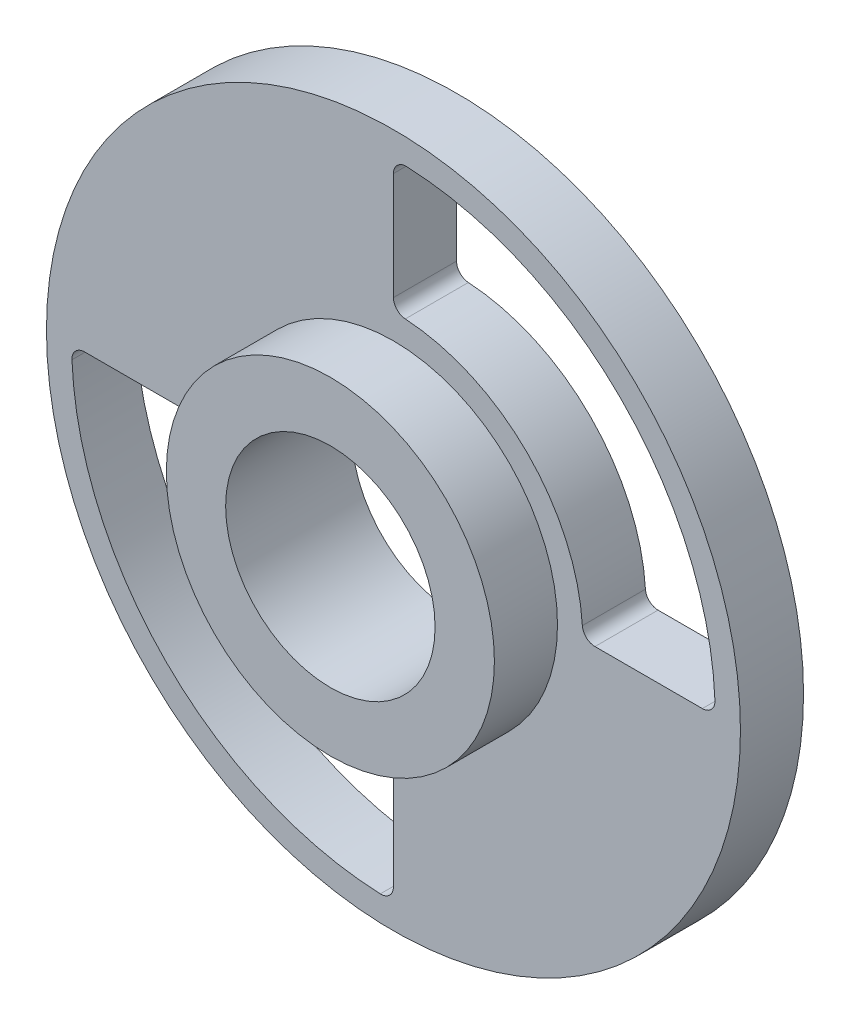
ISO-10303-21;
HEADER;
FILE_DESCRIPTION(('STEP AP214'),'2;1');
FILE_NAME('part.step','',(''),(''),'','','');
FILE_SCHEMA(('AUTOMOTIVE_DESIGN { 1 0 10303 214 1 1 1 1 }'));
ENDSEC;
DATA;
#1=APPLICATION_CONTEXT('core data for automotive mechanical design processes');
#2=APPLICATION_PROTOCOL_DEFINITION('international standard','automotive_design',2000,#1);
#3=PRODUCT_CONTEXT('',#1,'mechanical');
#4=PRODUCT('Part','Part','',(#3));
#5=PRODUCT_RELATED_PRODUCT_CATEGORY('part','',(#4));
#6=PRODUCT_DEFINITION_FORMATION('','',#4);
#7=PRODUCT_DEFINITION_CONTEXT('part definition',#1,'design');
#8=PRODUCT_DEFINITION('design','',#6,#7);
#9=PRODUCT_DEFINITION_SHAPE('','',#8);
#10=(LENGTH_UNIT() NAMED_UNIT(*) SI_UNIT(.MILLI.,.METRE.));
#11=(NAMED_UNIT(*) PLANE_ANGLE_UNIT() SI_UNIT($,.RADIAN.));
#12=(NAMED_UNIT(*) SI_UNIT($,.STERADIAN.) SOLID_ANGLE_UNIT());
#13=UNCERTAINTY_MEASURE_WITH_UNIT(LENGTH_MEASURE(1.E-05),#10,'distance_accuracy_value','');
#14=(GEOMETRIC_REPRESENTATION_CONTEXT(3) GLOBAL_UNCERTAINTY_ASSIGNED_CONTEXT((#13)) GLOBAL_UNIT_ASSIGNED_CONTEXT((#10,
#11,#12)) REPRESENTATION_CONTEXT('',''));
#15=CARTESIAN_POINT('',(0.,0.,0.));
#16=DIRECTION('',(0.,0.,1.));
#17=DIRECTION('',(1.,0.,0.));
#18=AXIS2_PLACEMENT_3D('',#15,#16,#17);
#19=CARTESIAN_POINT('',(0.,0.,2.5));
#20=DIRECTION('',(0.,0.,1.));
#21=DIRECTION('',(1.,0.,0.));
#22=AXIS2_PLACEMENT_3D('',#19,#20,#21);
#23=PLANE('',#22);
#24=CARTESIAN_POINT('',(0.,0.,2.5));
#25=DIRECTION('',(0.,0.,1.));
#26=DIRECTION('',(1.,0.,0.));
#27=AXIS2_PLACEMENT_3D('',#24,#25,#26);
#28=CIRCLE('',#27,7.5);
#29=CARTESIAN_POINT('',(-0.46875,-7.48533722937718,2.5));
#30=VERTEX_POINT('',#29);
#31=CARTESIAN_POINT('',(-7.48533722937718,-0.468749999999974,2.5));
#32=VERTEX_POINT('',#31);
#33=EDGE_CURVE('E222',#30,#32,#28,.F.);
#34=ORIENTED_EDGE('',*,*,#33,.F.);
#35=CARTESIAN_POINT('',(-0.5,-7.98435971133565,2.5));
#36=DIRECTION('',(0.,0.,1.));
#37=DIRECTION('',(1.,0.,0.));
#38=AXIS2_PLACEMENT_3D('',#35,#36,#37);
#39=CIRCLE('',#38,0.5);
#40=CARTESIAN_POINT('',(0.,-7.98435971133565,2.5));
#41=VERTEX_POINT('',#40);
#42=EDGE_CURVE('E213',#30,#41,#39,.F.);
#43=ORIENTED_EDGE('',*,*,#42,.T.);
#44=DIRECTION('',(0.,1.,0.));
#45=VECTOR('',#44,1.);
#46=CARTESIAN_POINT('',(0.,0.,2.5));
#47=LINE('',#46,#45);
#48=CARTESIAN_POINT('',(0.,-12.2397916648936,2.5));
#49=VERTEX_POINT('',#48);
#50=EDGE_CURVE('E219',#49,#41,#47,.T.);
#51=ORIENTED_EDGE('',*,*,#50,.F.);
#52=CARTESIAN_POINT('',(-0.5,-12.2397916648936,2.5));
#53=DIRECTION('',(0.,0.,1.));
#54=DIRECTION('',(1.,0.,0.));
#55=AXIS2_PLACEMENT_3D('',#52,#53,#54);
#56=CIRCLE('',#55,0.5);
#57=CARTESIAN_POINT('',(-0.520408163265306,-12.7393749981546,2.5));
#58=VERTEX_POINT('',#57);
#59=EDGE_CURVE('E11',#49,#58,#56,.F.);
#60=ORIENTED_EDGE('',*,*,#59,.T.);
#61=CARTESIAN_POINT('',(0.,0.,2.5));
#62=DIRECTION('',(0.,0.,1.));
#63=DIRECTION('',(1.,0.,0.));
#64=AXIS2_PLACEMENT_3D('',#61,#62,#63);
#65=CIRCLE('',#64,12.75);
#66=CARTESIAN_POINT('',(-12.7393749981546,-0.520408163265262,2.5));
#67=VERTEX_POINT('',#66);
#68=EDGE_CURVE('E226',#58,#67,#65,.F.);
#69=ORIENTED_EDGE('',*,*,#68,.T.);
#70=CARTESIAN_POINT('',(-12.2397916648936,-0.499999999999957,2.5));
#71=DIRECTION('',(0.,0.,1.));
#72=DIRECTION('',(1.,0.,0.));
#73=AXIS2_PLACEMENT_3D('',#70,#71,#72);
#74=CIRCLE('',#73,0.5);
#75=CARTESIAN_POINT('',(-12.2397916648936,0.,2.5));
#76=VERTEX_POINT('',#75);
#77=EDGE_CURVE('E210',#67,#76,#74,.F.);
#78=ORIENTED_EDGE('',*,*,#77,.T.);
#79=DIRECTION('',(1.,0.,0.));
#80=VECTOR('',#79,1.);
#81=CARTESIAN_POINT('',(0.,0.,2.5));
#82=LINE('',#81,#80);
#83=CARTESIAN_POINT('',(-7.98435971133565,0.,2.5));
#84=VERTEX_POINT('',#83);
#85=EDGE_CURVE('E283',#76,#84,#82,.T.);
#86=ORIENTED_EDGE('',*,*,#85,.T.);
#87=CARTESIAN_POINT('',(-7.98435971133566,-0.499999999999972,2.5));
#88=DIRECTION('',(0.,0.,1.));
#89=DIRECTION('',(1.,0.,0.));
#90=AXIS2_PLACEMENT_3D('',#87,#88,#89);
#91=CIRCLE('',#90,0.5);
#92=EDGE_CURVE('E206',#84,#32,#91,.F.);
#93=ORIENTED_EDGE('',*,*,#92,.T.);
#94=EDGE_LOOP('',(#34,#43,#51,#60,#69,#78,#86,#93));
#95=FACE_BOUND('',#94,.T.);
#96=CARTESIAN_POINT('',(0.,0.,2.5));
#97=DIRECTION('',(0.,0.,1.));
#98=DIRECTION('',(1.,0.,0.));
#99=AXIS2_PLACEMENT_3D('',#96,#97,#98);
#100=CIRCLE('',#99,7.5);
#101=CARTESIAN_POINT('',(0.46875,7.48533722937718,2.5));
#102=VERTEX_POINT('',#101);
#103=CARTESIAN_POINT('',(7.48533722937718,0.468749999999974,2.5));
#104=VERTEX_POINT('',#103);
#105=EDGE_CURVE('E151',#102,#104,#100,.F.);
#106=ORIENTED_EDGE('',*,*,#105,.F.);
#107=CARTESIAN_POINT('',(0.5,7.98435971133565,2.5));
#108=DIRECTION('',(0.,0.,1.));
#109=DIRECTION('',(1.,0.,0.));
#110=AXIS2_PLACEMENT_3D('',#107,#108,#109);
#111=CIRCLE('',#110,0.5);
#112=CARTESIAN_POINT('',(0.,7.98435971133565,2.5));
#113=VERTEX_POINT('',#112);
#114=EDGE_CURVE('E163',#102,#113,#111,.F.);
#115=ORIENTED_EDGE('',*,*,#114,.T.);
#116=DIRECTION('',(0.,-1.,0.));
#117=VECTOR('',#116,1.);
#118=CARTESIAN_POINT('',(0.,0.,2.5));
#119=LINE('',#118,#117);
#120=CARTESIAN_POINT('',(0.,12.2397916648936,2.5));
#121=VERTEX_POINT('',#120);
#122=EDGE_CURVE('E301',#121,#113,#119,.T.);
#123=ORIENTED_EDGE('',*,*,#122,.F.);
#124=CARTESIAN_POINT('',(0.5,12.2397916648936,2.5));
#125=DIRECTION('',(0.,0.,1.));
#126=DIRECTION('',(1.,0.,0.));
#127=AXIS2_PLACEMENT_3D('',#124,#125,#126);
#128=CIRCLE('',#127,0.5);
#129=CARTESIAN_POINT('',(0.520408163265306,12.7393749981546,2.5));
#130=VERTEX_POINT('',#129);
#131=EDGE_CURVE('E178',#121,#130,#128,.F.);
#132=ORIENTED_EDGE('',*,*,#131,.T.);
#133=CARTESIAN_POINT('',(0.,0.,2.5));
#134=DIRECTION('',(0.,0.,1.));
#135=DIRECTION('',(1.,0.,0.));
#136=AXIS2_PLACEMENT_3D('',#133,#134,#135);
#137=CIRCLE('',#136,12.75);
#138=CARTESIAN_POINT('',(12.7393749981546,0.520408163265262,2.5));
#139=VERTEX_POINT('',#138);
#140=EDGE_CURVE('E303',#130,#139,#137,.F.);
#141=ORIENTED_EDGE('',*,*,#140,.T.);
#142=CARTESIAN_POINT('',(12.2397916648936,0.499999999999957,2.5));
#143=DIRECTION('',(0.,0.,1.));
#144=DIRECTION('',(1.,0.,0.));
#145=AXIS2_PLACEMENT_3D('',#142,#143,#144);
#146=CIRCLE('',#145,0.5);
#147=CARTESIAN_POINT('',(12.2397916648936,0.,2.5));
#148=VERTEX_POINT('',#147);
#149=EDGE_CURVE('E180',#139,#148,#146,.F.);
#150=ORIENTED_EDGE('',*,*,#149,.T.);
#151=DIRECTION('',(-1.,0.,0.));
#152=VECTOR('',#151,1.);
#153=CARTESIAN_POINT('',(0.,0.,2.5));
#154=LINE('',#153,#152);
#155=CARTESIAN_POINT('',(7.98435971133565,0.,2.5));
#156=VERTEX_POINT('',#155);
#157=EDGE_CURVE('E169',#148,#156,#154,.T.);
#158=ORIENTED_EDGE('',*,*,#157,.T.);
#159=CARTESIAN_POINT('',(7.98435971133566,0.499999999999972,2.5));
#160=DIRECTION('',(0.,0.,1.));
#161=DIRECTION('',(1.,0.,0.));
#162=AXIS2_PLACEMENT_3D('',#159,#160,#161);
#163=CIRCLE('',#162,0.5);
#164=EDGE_CURVE('E167',#156,#104,#163,.F.);
#165=ORIENTED_EDGE('',*,*,#164,.T.);
#166=EDGE_LOOP('',(#106,#115,#123,#132,#141,#150,#158,#165));
#167=FACE_BOUND('',#166,.T.);
#168=CARTESIAN_POINT('',(0.,0.,2.5));
#169=DIRECTION('',(0.,0.,1.));
#170=DIRECTION('',(1.,0.,0.));
#171=AXIS2_PLACEMENT_3D('',#168,#169,#170);
#172=CIRCLE('',#171,13.75);
#173=CARTESIAN_POINT('',(13.75,0.,2.5));
#174=VERTEX_POINT('',#173);
#175=EDGE_CURVE('E158',#174,#174,#172,.T.);
#176=ORIENTED_EDGE('',*,*,#175,.T.);
#177=EDGE_LOOP('',(#176));
#178=FACE_BOUND('',#177,.T.);
#179=CARTESIAN_POINT('',(0.,0.,2.5));
#180=DIRECTION('',(0.,0.,1.));
#181=DIRECTION('',(1.,0.,0.));
#182=AXIS2_PLACEMENT_3D('',#179,#180,#181);
#183=CIRCLE('',#182,6.5);
#184=CARTESIAN_POINT('',(6.5,0.,2.5));
#185=VERTEX_POINT('',#184);
#186=EDGE_CURVE('E309',#185,#185,#183,.T.);
#187=ORIENTED_EDGE('',*,*,#186,.F.);
#188=EDGE_LOOP('',(#187));
#189=FACE_BOUND('',#188,.T.);
#190=ADVANCED_FACE('F33',(#95,#167,#178,#189),#23,.T.);
#191=CARTESIAN_POINT('',(0.,0.,0.));
#192=DIRECTION('',(0.,0.,1.));
#193=DIRECTION('',(1.,0.,0.));
#194=AXIS2_PLACEMENT_3D('',#191,#192,#193);
#195=PLANE('',#194);
#196=DIRECTION('',(0.,-1.,0.));
#197=VECTOR('',#196,1.);
#198=CARTESIAN_POINT('',(0.,0.,0.));
#199=LINE('',#198,#197);
#200=CARTESIAN_POINT('',(0.,-7.98435971133565,0.));
#201=VERTEX_POINT('',#200);
#202=CARTESIAN_POINT('',(0.,-12.2397916648936,0.));
#203=VERTEX_POINT('',#202);
#204=EDGE_CURVE('E227',#201,#203,#199,.T.);
#205=ORIENTED_EDGE('',*,*,#204,.F.);
#206=CARTESIAN_POINT('',(-0.5,-7.98435971133565,0.));
#207=DIRECTION('',(0.,0.,1.));
#208=DIRECTION('',(1.,0.,0.));
#209=AXIS2_PLACEMENT_3D('',#206,#207,#208);
#210=CIRCLE('',#209,0.5);
#211=CARTESIAN_POINT('',(-0.46875,-7.48533722937718,0.));
#212=VERTEX_POINT('',#211);
#213=EDGE_CURVE('E55',#201,#212,#210,.T.);
#214=ORIENTED_EDGE('',*,*,#213,.T.);
#215=CARTESIAN_POINT('',(0.,0.,0.));
#216=DIRECTION('',(0.,0.,1.));
#217=DIRECTION('',(-1.,0.,0.));
#218=AXIS2_PLACEMENT_3D('',#215,#216,#217);
#219=CIRCLE('',#218,7.5);
#220=CARTESIAN_POINT('',(-7.48533722937718,-0.468749999999974,0.));
#221=VERTEX_POINT('',#220);
#222=EDGE_CURVE('E529',#221,#212,#219,.T.);
#223=ORIENTED_EDGE('',*,*,#222,.F.);
#224=CARTESIAN_POINT('',(-7.98435971133566,-0.499999999999972,0.));
#225=DIRECTION('',(0.,0.,1.));
#226=DIRECTION('',(1.,0.,0.));
#227=AXIS2_PLACEMENT_3D('',#224,#225,#226);
#228=CIRCLE('',#227,0.5);
#229=CARTESIAN_POINT('',(-7.98435971133565,0.,0.));
#230=VERTEX_POINT('',#229);
#231=EDGE_CURVE('E204',#221,#230,#228,.T.);
#232=ORIENTED_EDGE('',*,*,#231,.T.);
#233=DIRECTION('',(-1.,0.,0.));
#234=VECTOR('',#233,1.);
#235=CARTESIAN_POINT('',(0.,0.,0.));
#236=LINE('',#235,#234);
#237=CARTESIAN_POINT('',(-12.2397916648936,0.,0.));
#238=VERTEX_POINT('',#237);
#239=EDGE_CURVE('E523',#230,#238,#236,.T.);
#240=ORIENTED_EDGE('',*,*,#239,.T.);
#241=CARTESIAN_POINT('',(-12.2397916648936,-0.499999999999957,0.));
#242=DIRECTION('',(0.,0.,1.));
#243=DIRECTION('',(1.,0.,0.));
#244=AXIS2_PLACEMENT_3D('',#241,#242,#243);
#245=CIRCLE('',#244,0.5);
#246=CARTESIAN_POINT('',(-12.7393749981546,-0.520408163265262,0.));
#247=VERTEX_POINT('',#246);
#248=EDGE_CURVE('E208',#238,#247,#245,.T.);
#249=ORIENTED_EDGE('',*,*,#248,.T.);
#250=CARTESIAN_POINT('',(0.,0.,0.));
#251=DIRECTION('',(0.,0.,1.));
#252=DIRECTION('',(-1.,0.,0.));
#253=AXIS2_PLACEMENT_3D('',#250,#251,#252);
#254=CIRCLE('',#253,12.75);
#255=CARTESIAN_POINT('',(-0.520408163265306,-12.7393749981546,0.));
#256=VERTEX_POINT('',#255);
#257=EDGE_CURVE('E518',#247,#256,#254,.T.);
#258=ORIENTED_EDGE('',*,*,#257,.T.);
#259=CARTESIAN_POINT('',(-0.5,-12.2397916648936,0.));
#260=DIRECTION('',(0.,0.,1.));
#261=DIRECTION('',(1.,0.,0.));
#262=AXIS2_PLACEMENT_3D('',#259,#260,#261);
#263=CIRCLE('',#262,0.5);
#264=EDGE_CURVE('E41',#256,#203,#263,.T.);
#265=ORIENTED_EDGE('',*,*,#264,.T.);
#266=EDGE_LOOP('',(#205,#214,#223,#232,#240,#249,#258,#265));
#267=FACE_BOUND('',#266,.T.);
#268=DIRECTION('',(0.,1.,0.));
#269=VECTOR('',#268,1.);
#270=CARTESIAN_POINT('',(0.,0.,0.));
#271=LINE('',#270,#269);
#272=CARTESIAN_POINT('',(0.,7.98435971133565,0.));
#273=VERTEX_POINT('',#272);
#274=CARTESIAN_POINT('',(0.,12.2397916648936,0.));
#275=VERTEX_POINT('',#274);
#276=EDGE_CURVE('E298',#273,#275,#271,.T.);
#277=ORIENTED_EDGE('',*,*,#276,.F.);
#278=CARTESIAN_POINT('',(0.5,7.98435971133565,0.));
#279=DIRECTION('',(0.,0.,1.));
#280=DIRECTION('',(1.,0.,0.));
#281=AXIS2_PLACEMENT_3D('',#278,#279,#280);
#282=CIRCLE('',#281,0.5);
#283=CARTESIAN_POINT('',(0.46875,7.48533722937718,0.));
#284=VERTEX_POINT('',#283);
#285=EDGE_CURVE('E176',#273,#284,#282,.T.);
#286=ORIENTED_EDGE('',*,*,#285,.T.);
#287=CARTESIAN_POINT('',(0.,0.,0.));
#288=DIRECTION('',(0.,0.,1.));
#289=DIRECTION('',(1.,0.,0.));
#290=AXIS2_PLACEMENT_3D('',#287,#288,#289);
#291=CIRCLE('',#290,7.5);
#292=CARTESIAN_POINT('',(7.48533722937718,0.468749999999974,0.));
#293=VERTEX_POINT('',#292);
#294=EDGE_CURVE('E154',#293,#284,#291,.T.);
#295=ORIENTED_EDGE('',*,*,#294,.F.);
#296=CARTESIAN_POINT('',(7.98435971133566,0.499999999999972,0.));
#297=DIRECTION('',(0.,0.,1.));
#298=DIRECTION('',(1.,0.,0.));
#299=AXIS2_PLACEMENT_3D('',#296,#297,#298);
#300=CIRCLE('',#299,0.5);
#301=CARTESIAN_POINT('',(7.98435971133565,0.,0.));
#302=VERTEX_POINT('',#301);
#303=EDGE_CURVE('E337',#293,#302,#300,.T.);
#304=ORIENTED_EDGE('',*,*,#303,.T.);
#305=DIRECTION('',(1.,0.,0.));
#306=VECTOR('',#305,1.);
#307=CARTESIAN_POINT('',(0.,0.,0.));
#308=LINE('',#307,#306);
#309=CARTESIAN_POINT('',(12.2397916648936,0.,0.));
#310=VERTEX_POINT('',#309);
#311=EDGE_CURVE('E288',#302,#310,#308,.T.);
#312=ORIENTED_EDGE('',*,*,#311,.T.);
#313=CARTESIAN_POINT('',(12.2397916648936,0.499999999999957,0.));
#314=DIRECTION('',(0.,0.,1.));
#315=DIRECTION('',(1.,0.,0.));
#316=AXIS2_PLACEMENT_3D('',#313,#314,#315);
#317=CIRCLE('',#316,0.5);
#318=CARTESIAN_POINT('',(12.7393749981546,0.520408163265262,0.));
#319=VERTEX_POINT('',#318);
#320=EDGE_CURVE('E340',#310,#319,#317,.T.);
#321=ORIENTED_EDGE('',*,*,#320,.T.);
#322=CARTESIAN_POINT('',(0.,0.,0.));
#323=DIRECTION('',(0.,0.,1.));
#324=DIRECTION('',(1.,0.,0.));
#325=AXIS2_PLACEMENT_3D('',#322,#323,#324);
#326=CIRCLE('',#325,12.75);
#327=CARTESIAN_POINT('',(0.520408163265306,12.7393749981546,0.));
#328=VERTEX_POINT('',#327);
#329=EDGE_CURVE('E295',#319,#328,#326,.T.);
#330=ORIENTED_EDGE('',*,*,#329,.T.);
#331=CARTESIAN_POINT('',(0.5,12.2397916648936,0.));
#332=DIRECTION('',(0.,0.,1.));
#333=DIRECTION('',(1.,0.,0.));
#334=AXIS2_PLACEMENT_3D('',#331,#332,#333);
#335=CIRCLE('',#334,0.5);
#336=EDGE_CURVE('E175',#328,#275,#335,.T.);
#337=ORIENTED_EDGE('',*,*,#336,.T.);
#338=EDGE_LOOP('',(#277,#286,#295,#304,#312,#321,#330,#337));
#339=FACE_BOUND('',#338,.T.);
#340=CARTESIAN_POINT('',(0.,0.,0.));
#341=DIRECTION('',(0.,0.,1.));
#342=DIRECTION('',(1.,0.,0.));
#343=AXIS2_PLACEMENT_3D('',#340,#341,#342);
#344=CIRCLE('',#343,13.75);
#345=CARTESIAN_POINT('',(13.75,0.,0.));
#346=VERTEX_POINT('',#345);
#347=EDGE_CURVE('E318',#346,#346,#344,.T.);
#348=ORIENTED_EDGE('',*,*,#347,.F.);
#349=EDGE_LOOP('',(#348));
#350=FACE_BOUND('',#349,.T.);
#351=CARTESIAN_POINT('',(0.,0.,0.));
#352=DIRECTION('',(0.,0.,1.));
#353=DIRECTION('',(1.,0.,0.));
#354=AXIS2_PLACEMENT_3D('',#351,#352,#353);
#355=CIRCLE('',#354,4.15);
#356=CARTESIAN_POINT('',(4.15,0.,0.));
#357=VERTEX_POINT('',#356);
#358=EDGE_CURVE('E313',#357,#357,#355,.T.);
#359=ORIENTED_EDGE('',*,*,#358,.T.);
#360=EDGE_LOOP('',(#359));
#361=FACE_BOUND('',#360,.T.);
#362=ADVANCED_FACE('F241',(#267,#339,#350,#361),#195,.F.);
#363=CARTESIAN_POINT('',(0.,0.,2.5));
#364=DIRECTION('',(0.,0.,-1.));
#365=DIRECTION('',(-1.,0.,0.));
#366=AXIS2_PLACEMENT_3D('',#363,#364,#365);
#367=CYLINDRICAL_SURFACE('',#366,13.75);
#368=ORIENTED_EDGE('',*,*,#175,.F.);
#369=EDGE_LOOP('',(#368));
#370=FACE_BOUND('',#369,.T.);
#371=ORIENTED_EDGE('',*,*,#347,.T.);
#372=EDGE_LOOP('',(#371));
#373=FACE_BOUND('',#372,.T.);
#374=ADVANCED_FACE('F246',(#370,#373),#367,.T.);
#375=CARTESIAN_POINT('',(0.,0.,2.5));
#376=DIRECTION('',(0.,0.,-1.));
#377=DIRECTION('',(-1.,0.,0.));
#378=AXIS2_PLACEMENT_3D('',#375,#376,#377);
#379=CYLINDRICAL_SURFACE('',#378,4.15);
#380=ORIENTED_EDGE('',*,*,#358,.F.);
#381=EDGE_LOOP('',(#380));
#382=FACE_BOUND('',#381,.T.);
#383=CARTESIAN_POINT('',(0.,0.,5.));
#384=DIRECTION('',(0.,0.,1.));
#385=DIRECTION('',(1.,0.,0.));
#386=AXIS2_PLACEMENT_3D('',#383,#384,#385);
#387=CIRCLE('',#386,4.15);
#388=CARTESIAN_POINT('',(4.15,0.,5.));
#389=VERTEX_POINT('',#388);
#390=EDGE_CURVE('E168',#389,#389,#387,.T.);
#391=ORIENTED_EDGE('',*,*,#390,.T.);
#392=EDGE_LOOP('',(#391));
#393=FACE_BOUND('',#392,.T.);
#394=ADVANCED_FACE('F249',(#382,#393),#379,.F.);
#395=CARTESIAN_POINT('',(0.,0.,5.));
#396=DIRECTION('',(0.,0.,1.));
#397=DIRECTION('',(1.,0.,0.));
#398=AXIS2_PLACEMENT_3D('',#395,#396,#397);
#399=PLANE('',#398);
#400=CARTESIAN_POINT('',(0.,0.,5.));
#401=DIRECTION('',(0.,0.,1.));
#402=DIRECTION('',(1.,0.,0.));
#403=AXIS2_PLACEMENT_3D('',#400,#401,#402);
#404=CIRCLE('',#403,6.5);
#405=CARTESIAN_POINT('',(6.5,0.,5.));
#406=VERTEX_POINT('',#405);
#407=EDGE_CURVE('E310',#406,#406,#404,.T.);
#408=ORIENTED_EDGE('',*,*,#407,.T.);
#409=EDGE_LOOP('',(#408));
#410=FACE_BOUND('',#409,.T.);
#411=ORIENTED_EDGE('',*,*,#390,.F.);
#412=EDGE_LOOP('',(#411));
#413=FACE_BOUND('',#412,.T.);
#414=ADVANCED_FACE('F374',(#410,#413),#399,.T.);
#415=CARTESIAN_POINT('',(0.,0.,5.));
#416=DIRECTION('',(0.,0.,-1.));
#417=DIRECTION('',(-1.,0.,0.));
#418=AXIS2_PLACEMENT_3D('',#415,#416,#417);
#419=CYLINDRICAL_SURFACE('',#418,6.5);
#420=ORIENTED_EDGE('',*,*,#407,.F.);
#421=EDGE_LOOP('',(#420));
#422=FACE_BOUND('',#421,.T.);
#423=ORIENTED_EDGE('',*,*,#186,.T.);
#424=EDGE_LOOP('',(#423));
#425=FACE_BOUND('',#424,.T.);
#426=ADVANCED_FACE('F373',(#422,#425),#419,.T.);
#427=CARTESIAN_POINT('',(0.,0.,5.));
#428=DIRECTION('',(0.,0.,-1.));
#429=DIRECTION('',(-1.,0.,0.));
#430=AXIS2_PLACEMENT_3D('',#427,#428,#429);
#431=CYLINDRICAL_SURFACE('',#430,7.5);
#432=ORIENTED_EDGE('',*,*,#105,.T.);
#433=DIRECTION('',(0.,0.,-1.));
#434=VECTOR('',#433,1.);
#435=CARTESIAN_POINT('',(7.48533722937718,0.468749999999974,5.));
#436=LINE('',#435,#434);
#437=EDGE_CURVE('E157',#104,#293,#436,.T.);
#438=ORIENTED_EDGE('',*,*,#437,.T.);
#439=ORIENTED_EDGE('',*,*,#294,.T.);
#440=DIRECTION('',(0.,0.,-1.));
#441=VECTOR('',#440,1.);
#442=CARTESIAN_POINT('',(0.46875,7.48533722937718,5.));
#443=LINE('',#442,#441);
#444=EDGE_CURVE('E147',#284,#102,#443,.F.);
#445=ORIENTED_EDGE('',*,*,#444,.T.);
#446=EDGE_LOOP('',(#432,#438,#439,#445));
#447=FACE_BOUND('',#446,.T.);
#448=ADVANCED_FACE('F149',(#447),#431,.T.);
#449=CARTESIAN_POINT('',(0.,0.,5.));
#450=DIRECTION('',(0.,1.,0.));
#451=DIRECTION('',(-1.,0.,0.));
#452=AXIS2_PLACEMENT_3D('',#449,#450,#451);
#453=PLANE('',#452);
#454=ORIENTED_EDGE('',*,*,#311,.F.);
#455=DIRECTION('',(0.,0.,-1.));
#456=VECTOR('',#455,1.);
#457=CARTESIAN_POINT('',(7.98435971133565,0.,5.));
#458=LINE('',#457,#456);
#459=EDGE_CURVE('E327',#302,#156,#458,.F.);
#460=ORIENTED_EDGE('',*,*,#459,.T.);
#461=ORIENTED_EDGE('',*,*,#157,.F.);
#462=DIRECTION('',(0.,0.,1.));
#463=VECTOR('',#462,1.);
#464=CARTESIAN_POINT('',(12.2397916648936,0.,0.));
#465=LINE('',#464,#463);
#466=EDGE_CURVE('E324',#148,#310,#465,.F.);
#467=ORIENTED_EDGE('',*,*,#466,.T.);
#468=EDGE_LOOP('',(#454,#460,#461,#467));
#469=FACE_BOUND('',#468,.T.);
#470=ADVANCED_FACE('F348',(#469),#453,.T.);
#471=CARTESIAN_POINT('',(0.,0.,5.));
#472=DIRECTION('',(0.,0.,-1.));
#473=DIRECTION('',(-1.,0.,0.));
#474=AXIS2_PLACEMENT_3D('',#471,#472,#473);
#475=CYLINDRICAL_SURFACE('',#474,12.75);
#476=ORIENTED_EDGE('',*,*,#329,.F.);
#477=DIRECTION('',(0.,0.,-1.));
#478=VECTOR('',#477,1.);
#479=CARTESIAN_POINT('',(12.7393749981546,0.520408163265262,5.));
#480=LINE('',#479,#478);
#481=EDGE_CURVE('E332',#319,#139,#480,.F.);
#482=ORIENTED_EDGE('',*,*,#481,.T.);
#483=ORIENTED_EDGE('',*,*,#140,.F.);
#484=DIRECTION('',(0.,0.,-1.));
#485=VECTOR('',#484,1.);
#486=CARTESIAN_POINT('',(0.520408163265306,12.7393749981546,5.));
#487=LINE('',#486,#485);
#488=EDGE_CURVE('E329',#130,#328,#487,.T.);
#489=ORIENTED_EDGE('',*,*,#488,.T.);
#490=EDGE_LOOP('',(#476,#482,#483,#489));
#491=FACE_BOUND('',#490,.T.);
#492=ADVANCED_FACE('F355',(#491),#475,.F.);
#493=CARTESIAN_POINT('',(0.,0.,5.));
#494=DIRECTION('',(-1.,0.,0.));
#495=DIRECTION('',(0.,0.,1.));
#496=AXIS2_PLACEMENT_3D('',#493,#494,#495);
#497=PLANE('',#496);
#498=ORIENTED_EDGE('',*,*,#122,.T.);
#499=DIRECTION('',(0.,0.,1.));
#500=VECTOR('',#499,1.);
#501=CARTESIAN_POINT('',(0.,7.98435971133565,0.));
#502=LINE('',#501,#500);
#503=EDGE_CURVE('E174',#113,#273,#502,.F.);
#504=ORIENTED_EDGE('',*,*,#503,.T.);
#505=ORIENTED_EDGE('',*,*,#276,.T.);
#506=DIRECTION('',(0.,0.,-1.));
#507=VECTOR('',#506,1.);
#508=CARTESIAN_POINT('',(0.,12.2397916648936,5.));
#509=LINE('',#508,#507);
#510=EDGE_CURVE('E334',#275,#121,#509,.F.);
#511=ORIENTED_EDGE('',*,*,#510,.T.);
#512=EDGE_LOOP('',(#498,#504,#505,#511));
#513=FACE_BOUND('',#512,.T.);
#514=ADVANCED_FACE('F259',(#513),#497,.F.);
#515=CARTESIAN_POINT('',(7.98435971133566,0.499999999999972,5.));
#516=DIRECTION('',(0.,0.,-1.));
#517=DIRECTION('',(-1.,0.,0.));
#518=AXIS2_PLACEMENT_3D('',#515,#516,#517);
#519=CYLINDRICAL_SURFACE('',#518,0.5);
#520=ORIENTED_EDGE('',*,*,#164,.F.);
#521=ORIENTED_EDGE('',*,*,#459,.F.);
#522=ORIENTED_EDGE('',*,*,#303,.F.);
#523=ORIENTED_EDGE('',*,*,#437,.F.);
#524=EDGE_LOOP('',(#520,#521,#522,#523));
#525=FACE_BOUND('',#524,.T.);
#526=ADVANCED_FACE('F255',(#525),#519,.F.);
#527=CARTESIAN_POINT('',(12.2397916648936,0.499999999999957,5.));
#528=DIRECTION('',(0.,0.,-1.));
#529=DIRECTION('',(-1.,0.,0.));
#530=AXIS2_PLACEMENT_3D('',#527,#528,#529);
#531=CYLINDRICAL_SURFACE('',#530,0.5);
#532=ORIENTED_EDGE('',*,*,#149,.F.);
#533=ORIENTED_EDGE('',*,*,#481,.F.);
#534=ORIENTED_EDGE('',*,*,#320,.F.);
#535=ORIENTED_EDGE('',*,*,#466,.F.);
#536=EDGE_LOOP('',(#532,#533,#534,#535));
#537=FACE_BOUND('',#536,.T.);
#538=ADVANCED_FACE('F258',(#537),#531,.F.);
#539=CARTESIAN_POINT('',(0.5,7.98435971133565,5.));
#540=DIRECTION('',(0.,0.,-1.));
#541=DIRECTION('',(-1.,0.,0.));
#542=AXIS2_PLACEMENT_3D('',#539,#540,#541);
#543=CYLINDRICAL_SURFACE('',#542,0.5);
#544=ORIENTED_EDGE('',*,*,#114,.F.);
#545=ORIENTED_EDGE('',*,*,#444,.F.);
#546=ORIENTED_EDGE('',*,*,#285,.F.);
#547=ORIENTED_EDGE('',*,*,#503,.F.);
#548=EDGE_LOOP('',(#544,#545,#546,#547));
#549=FACE_BOUND('',#548,.T.);
#550=ADVANCED_FACE('F172',(#549),#543,.F.);
#551=CARTESIAN_POINT('',(0.5,12.2397916648936,5.));
#552=DIRECTION('',(0.,0.,-1.));
#553=DIRECTION('',(-1.,0.,0.));
#554=AXIS2_PLACEMENT_3D('',#551,#552,#553);
#555=CYLINDRICAL_SURFACE('',#554,0.5);
#556=ORIENTED_EDGE('',*,*,#131,.F.);
#557=ORIENTED_EDGE('',*,*,#510,.F.);
#558=ORIENTED_EDGE('',*,*,#336,.F.);
#559=ORIENTED_EDGE('',*,*,#488,.F.);
#560=EDGE_LOOP('',(#556,#557,#558,#559));
#561=FACE_BOUND('',#560,.T.);
#562=ADVANCED_FACE('F266',(#561),#555,.F.);
#563=CARTESIAN_POINT('',(0.,0.,5.));
#564=DIRECTION('',(0.,0.,-1.));
#565=DIRECTION('',(-1.,0.,0.));
#566=AXIS2_PLACEMENT_3D('',#563,#564,#565);
#567=CYLINDRICAL_SURFACE('',#566,7.5);
#568=ORIENTED_EDGE('',*,*,#33,.T.);
#569=DIRECTION('',(0.,0.,-1.));
#570=VECTOR('',#569,1.);
#571=CARTESIAN_POINT('',(-7.48533722937718,-0.468749999999974,5.));
#572=LINE('',#571,#570);
#573=EDGE_CURVE('E187',#32,#221,#572,.T.);
#574=ORIENTED_EDGE('',*,*,#573,.T.);
#575=ORIENTED_EDGE('',*,*,#222,.T.);
#576=DIRECTION('',(0.,0.,-1.));
#577=VECTOR('',#576,1.);
#578=CARTESIAN_POINT('',(-0.46875,-7.48533722937718,5.));
#579=LINE('',#578,#577);
#580=EDGE_CURVE('E185',#212,#30,#579,.F.);
#581=ORIENTED_EDGE('',*,*,#580,.T.);
#582=EDGE_LOOP('',(#568,#574,#575,#581));
#583=FACE_BOUND('',#582,.T.);
#584=ADVANCED_FACE('F269',(#583),#567,.T.);
#585=CARTESIAN_POINT('',(0.,0.,5.));
#586=DIRECTION('',(0.,-1.,0.));
#587=DIRECTION('',(1.,0.,0.));
#588=AXIS2_PLACEMENT_3D('',#585,#586,#587);
#589=PLANE('',#588);
#590=ORIENTED_EDGE('',*,*,#239,.F.);
#591=DIRECTION('',(0.,0.,-1.));
#592=VECTOR('',#591,1.);
#593=CARTESIAN_POINT('',(-7.98435971133565,0.,5.));
#594=LINE('',#593,#592);
#595=EDGE_CURVE('E193',#230,#84,#594,.F.);
#596=ORIENTED_EDGE('',*,*,#595,.T.);
#597=ORIENTED_EDGE('',*,*,#85,.F.);
#598=DIRECTION('',(0.,0.,1.));
#599=VECTOR('',#598,1.);
#600=CARTESIAN_POINT('',(-12.2397916648936,0.,0.));
#601=LINE('',#600,#599);
#602=EDGE_CURVE('E190',#76,#238,#601,.F.);
#603=ORIENTED_EDGE('',*,*,#602,.T.);
#604=EDGE_LOOP('',(#590,#596,#597,#603));
#605=FACE_BOUND('',#604,.T.);
#606=ADVANCED_FACE('F471',(#605),#589,.T.);
#607=CARTESIAN_POINT('',(0.,0.,5.));
#608=DIRECTION('',(0.,0.,-1.));
#609=DIRECTION('',(-1.,0.,0.));
#610=AXIS2_PLACEMENT_3D('',#607,#608,#609);
#611=CYLINDRICAL_SURFACE('',#610,12.75);
#612=ORIENTED_EDGE('',*,*,#257,.F.);
#613=DIRECTION('',(0.,0.,-1.));
#614=VECTOR('',#613,1.);
#615=CARTESIAN_POINT('',(-12.7393749981546,-0.520408163265262,5.));
#616=LINE('',#615,#614);
#617=EDGE_CURVE('E198',#247,#67,#616,.F.);
#618=ORIENTED_EDGE('',*,*,#617,.T.);
#619=ORIENTED_EDGE('',*,*,#68,.F.);
#620=DIRECTION('',(0.,0.,-1.));
#621=VECTOR('',#620,1.);
#622=CARTESIAN_POINT('',(-0.520408163265306,-12.7393749981546,5.));
#623=LINE('',#622,#621);
#624=EDGE_CURVE('E195',#58,#256,#623,.T.);
#625=ORIENTED_EDGE('',*,*,#624,.T.);
#626=EDGE_LOOP('',(#612,#618,#619,#625));
#627=FACE_BOUND('',#626,.T.);
#628=ADVANCED_FACE('F276',(#627),#611,.F.);
#629=CARTESIAN_POINT('',(0.,0.,5.));
#630=DIRECTION('',(1.,0.,0.));
#631=DIRECTION('',(0.,0.,-1.));
#632=AXIS2_PLACEMENT_3D('',#629,#630,#631);
#633=PLANE('',#632);
#634=ORIENTED_EDGE('',*,*,#50,.T.);
#635=DIRECTION('',(0.,0.,1.));
#636=VECTOR('',#635,1.);
#637=CARTESIAN_POINT('',(0.,-7.98435971133565,0.));
#638=LINE('',#637,#636);
#639=EDGE_CURVE('E202',#41,#201,#638,.F.);
#640=ORIENTED_EDGE('',*,*,#639,.T.);
#641=ORIENTED_EDGE('',*,*,#204,.T.);
#642=DIRECTION('',(0.,0.,-1.));
#643=VECTOR('',#642,1.);
#644=CARTESIAN_POINT('',(0.,-12.2397916648936,5.));
#645=LINE('',#644,#643);
#646=EDGE_CURVE('E200',#203,#49,#645,.F.);
#647=ORIENTED_EDGE('',*,*,#646,.T.);
#648=EDGE_LOOP('',(#634,#640,#641,#647));
#649=FACE_BOUND('',#648,.T.);
#650=ADVANCED_FACE('F224',(#649),#633,.F.);
#651=CARTESIAN_POINT('',(-7.98435971133566,-0.499999999999972,5.));
#652=DIRECTION('',(0.,0.,-1.));
#653=DIRECTION('',(-1.,0.,0.));
#654=AXIS2_PLACEMENT_3D('',#651,#652,#653);
#655=CYLINDRICAL_SURFACE('',#654,0.5);
#656=ORIENTED_EDGE('',*,*,#92,.F.);
#657=ORIENTED_EDGE('',*,*,#595,.F.);
#658=ORIENTED_EDGE('',*,*,#231,.F.);
#659=ORIENTED_EDGE('',*,*,#573,.F.);
#660=EDGE_LOOP('',(#656,#657,#658,#659));
#661=FACE_BOUND('',#660,.T.);
#662=ADVANCED_FACE('F237',(#661),#655,.F.);
#663=CARTESIAN_POINT('',(-12.2397916648936,-0.499999999999957,5.));
#664=DIRECTION('',(0.,0.,-1.));
#665=DIRECTION('',(-1.,0.,0.));
#666=AXIS2_PLACEMENT_3D('',#663,#664,#665);
#667=CYLINDRICAL_SURFACE('',#666,0.5);
#668=ORIENTED_EDGE('',*,*,#77,.F.);
#669=ORIENTED_EDGE('',*,*,#617,.F.);
#670=ORIENTED_EDGE('',*,*,#248,.F.);
#671=ORIENTED_EDGE('',*,*,#602,.F.);
#672=EDGE_LOOP('',(#668,#669,#670,#671));
#673=FACE_BOUND('',#672,.T.);
#674=ADVANCED_FACE('F231',(#673),#667,.F.);
#675=CARTESIAN_POINT('',(-0.5,-7.98435971133565,5.));
#676=DIRECTION('',(0.,0.,-1.));
#677=DIRECTION('',(-1.,0.,0.));
#678=AXIS2_PLACEMENT_3D('',#675,#676,#677);
#679=CYLINDRICAL_SURFACE('',#678,0.5);
#680=ORIENTED_EDGE('',*,*,#42,.F.);
#681=ORIENTED_EDGE('',*,*,#580,.F.);
#682=ORIENTED_EDGE('',*,*,#213,.F.);
#683=ORIENTED_EDGE('',*,*,#639,.F.);
#684=EDGE_LOOP('',(#680,#681,#682,#683));
#685=FACE_BOUND('',#684,.T.);
#686=ADVANCED_FACE('F229',(#685),#679,.F.);
#687=CARTESIAN_POINT('',(-0.5,-12.2397916648936,5.));
#688=DIRECTION('',(0.,0.,-1.));
#689=DIRECTION('',(-1.,0.,0.));
#690=AXIS2_PLACEMENT_3D('',#687,#688,#689);
#691=CYLINDRICAL_SURFACE('',#690,0.5);
#692=ORIENTED_EDGE('',*,*,#59,.F.);
#693=ORIENTED_EDGE('',*,*,#646,.F.);
#694=ORIENTED_EDGE('',*,*,#264,.F.);
#695=ORIENTED_EDGE('',*,*,#624,.F.);
#696=EDGE_LOOP('',(#692,#693,#694,#695));
#697=FACE_BOUND('',#696,.T.);
#698=ADVANCED_FACE('F35',(#697),#691,.F.);
#699=CLOSED_SHELL('',(#190,#362,#374,#394,#414,#426,#448,#470,#492,#514,#526,#538,#550,#562,
#584,#606,#628,#650,#662,#674,#686,#698));
#700=MANIFOLD_SOLID_BREP('B2',#699);
#701=ADVANCED_BREP_SHAPE_REPRESENTATION('',(#18,#700),#14);
#702=SHAPE_DEFINITION_REPRESENTATION(#9,#701);
ENDSEC;
END-ISO-10303-21;
